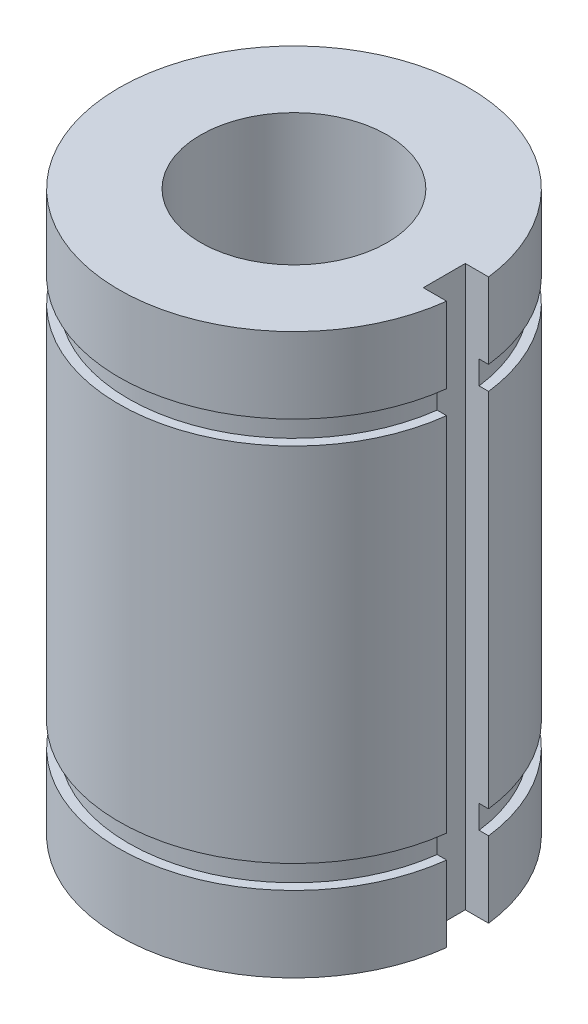
ISO-10303-21;
HEADER;
FILE_DESCRIPTION(('STEP AP214'),'2;1');
FILE_NAME('part.step','',(''),(''),'','','');
FILE_SCHEMA(('AUTOMOTIVE_DESIGN { 1 0 10303 214 1 1 1 1 }'));
ENDSEC;
DATA;
#1=APPLICATION_CONTEXT('core data for automotive mechanical design processes');
#2=APPLICATION_PROTOCOL_DEFINITION('international standard','automotive_design',2000,#1);
#3=PRODUCT_CONTEXT('',#1,'mechanical');
#4=PRODUCT('Part','Part','',(#3));
#5=PRODUCT_RELATED_PRODUCT_CATEGORY('part','',(#4));
#6=PRODUCT_DEFINITION_FORMATION('','',#4);
#7=PRODUCT_DEFINITION_CONTEXT('part definition',#1,'design');
#8=PRODUCT_DEFINITION('design','',#6,#7);
#9=PRODUCT_DEFINITION_SHAPE('','',#8);
#10=(LENGTH_UNIT() NAMED_UNIT(*) SI_UNIT(.MILLI.,.METRE.));
#11=(NAMED_UNIT(*) PLANE_ANGLE_UNIT() SI_UNIT($,.RADIAN.));
#12=(NAMED_UNIT(*) SI_UNIT($,.STERADIAN.) SOLID_ANGLE_UNIT());
#13=UNCERTAINTY_MEASURE_WITH_UNIT(LENGTH_MEASURE(1.E-05),#10,'distance_accuracy_value','');
#14=(GEOMETRIC_REPRESENTATION_CONTEXT(3) GLOBAL_UNCERTAINTY_ASSIGNED_CONTEXT((#13)) GLOBAL_UNIT_ASSIGNED_CONTEXT((#10,
#11,#12)) REPRESENTATION_CONTEXT('',''));
#15=CARTESIAN_POINT('',(0.,0.,0.));
#16=DIRECTION('',(0.,0.,1.));
#17=DIRECTION('',(1.,0.,0.));
#18=AXIS2_PLACEMENT_3D('',#15,#16,#17);
#19=CARTESIAN_POINT('',(0.,24.,0.));
#20=DIRECTION('',(0.,-1.,0.));
#21=DIRECTION('',(0.,0.,-1.));
#22=AXIS2_PLACEMENT_3D('',#19,#20,#21);
#23=CYLINDRICAL_SURFACE('',#22,7.5);
#24=DIRECTION('',(0.,-1.,0.));
#25=VECTOR('',#24,1.);
#26=CARTESIAN_POINT('',(7.44580418759451,24.,-0.899999999999999));
#27=LINE('',#26,#25);
#28=CARTESIAN_POINT('',(7.44580418759451,19.75,-0.899999999999999));
#29=VERTEX_POINT('',#28);
#30=CARTESIAN_POINT('',(7.44580418759451,4.25,-0.899999999999999));
#31=VERTEX_POINT('',#30);
#32=EDGE_CURVE('E212',#29,#31,#27,.T.);
#33=ORIENTED_EDGE('',*,*,#32,.T.);
#34=CARTESIAN_POINT('',(0.,4.25,0.));
#35=DIRECTION('',(0.,1.,0.));
#36=DIRECTION('',(0.,0.,1.));
#37=AXIS2_PLACEMENT_3D('',#34,#35,#36);
#38=CIRCLE('',#37,7.5);
#39=CARTESIAN_POINT('',(7.44580418759451,4.25,0.900000000000001));
#40=VERTEX_POINT('',#39);
#41=EDGE_CURVE('E133',#31,#40,#38,.T.);
#42=ORIENTED_EDGE('',*,*,#41,.T.);
#43=DIRECTION('',(0.,-1.,0.));
#44=VECTOR('',#43,1.);
#45=CARTESIAN_POINT('',(7.44580418759451,24.,0.900000000000001));
#46=LINE('',#45,#44);
#47=CARTESIAN_POINT('',(7.44580418759451,19.75,0.900000000000001));
#48=VERTEX_POINT('',#47);
#49=EDGE_CURVE('E207',#40,#48,#46,.F.);
#50=ORIENTED_EDGE('',*,*,#49,.T.);
#51=CARTESIAN_POINT('',(0.,19.75,0.));
#52=DIRECTION('',(0.,-1.,0.));
#53=DIRECTION('',(0.,0.,-1.));
#54=AXIS2_PLACEMENT_3D('',#51,#52,#53);
#55=CIRCLE('',#54,7.5);
#56=EDGE_CURVE('E164',#48,#29,#55,.T.);
#57=ORIENTED_EDGE('',*,*,#56,.T.);
#58=EDGE_LOOP('',(#33,#42,#50,#57));
#59=FACE_BOUND('',#58,.T.);
#60=ADVANCED_FACE('F33',(#59),#23,.T.);
#61=CARTESIAN_POINT('',(7.44580418759451,0.,0.900000000000001));
#62=VERTEX_POINT('',#61);
#63=CARTESIAN_POINT('',(7.44580418759451,3.25,0.900000000000001));
#64=VERTEX_POINT('',#63);
#65=EDGE_CURVE('E204',#62,#64,#46,.F.);
#66=ORIENTED_EDGE('',*,*,#65,.T.);
#67=CARTESIAN_POINT('',(0.,3.25,0.));
#68=DIRECTION('',(0.,-1.,0.));
#69=DIRECTION('',(0.,0.,-1.));
#70=AXIS2_PLACEMENT_3D('',#67,#68,#69);
#71=CIRCLE('',#70,7.5);
#72=CARTESIAN_POINT('',(7.44580418759451,3.25,-0.899999999999999));
#73=VERTEX_POINT('',#72);
#74=EDGE_CURVE('E48',#64,#73,#71,.T.);
#75=ORIENTED_EDGE('',*,*,#74,.T.);
#76=CARTESIAN_POINT('',(7.44580418759451,0.,-0.899999999999999));
#77=VERTEX_POINT('',#76);
#78=EDGE_CURVE('E142',#73,#77,#27,.T.);
#79=ORIENTED_EDGE('',*,*,#78,.T.);
#80=CARTESIAN_POINT('',(0.,0.,0.));
#81=DIRECTION('',(0.,1.,0.));
#82=DIRECTION('',(0.,0.,1.));
#83=AXIS2_PLACEMENT_3D('',#80,#81,#82);
#84=CIRCLE('',#83,7.5);
#85=EDGE_CURVE('E195',#77,#62,#84,.T.);
#86=ORIENTED_EDGE('',*,*,#85,.T.);
#87=EDGE_LOOP('',(#66,#75,#79,#86));
#88=FACE_BOUND('',#87,.T.);
#89=ADVANCED_FACE('F231',(#88),#23,.T.);
#90=CARTESIAN_POINT('',(0.,24.,0.));
#91=DIRECTION('',(0.,1.,0.));
#92=DIRECTION('',(0.,0.,1.));
#93=AXIS2_PLACEMENT_3D('',#90,#91,#92);
#94=PLANE('',#93);
#95=DIRECTION('',(1.,0.,0.));
#96=VECTOR('',#95,1.);
#97=CARTESIAN_POINT('',(8.44580418759451,24.,-0.899999999999999));
#98=LINE('',#97,#96);
#99=CARTESIAN_POINT('',(6.44580418759451,24.,-0.899999999999999));
#100=VERTEX_POINT('',#99);
#101=CARTESIAN_POINT('',(7.44580418759451,24.,-0.899999999999999));
#102=VERTEX_POINT('',#101);
#103=EDGE_CURVE('E178',#100,#102,#98,.T.);
#104=ORIENTED_EDGE('',*,*,#103,.T.);
#105=CARTESIAN_POINT('',(0.,24.,0.));
#106=DIRECTION('',(0.,1.,0.));
#107=DIRECTION('',(0.,0.,1.));
#108=AXIS2_PLACEMENT_3D('',#105,#106,#107);
#109=CIRCLE('',#108,7.5);
#110=CARTESIAN_POINT('',(7.44580418759451,24.,0.900000000000001));
#111=VERTEX_POINT('',#110);
#112=EDGE_CURVE('E198',#102,#111,#109,.T.);
#113=ORIENTED_EDGE('',*,*,#112,.T.);
#114=DIRECTION('',(-1.,0.,0.));
#115=VECTOR('',#114,1.);
#116=CARTESIAN_POINT('',(8.44580418759451,24.,0.900000000000001));
#117=LINE('',#116,#115);
#118=CARTESIAN_POINT('',(6.44580418759451,24.,0.900000000000001));
#119=VERTEX_POINT('',#118);
#120=EDGE_CURVE('E171',#111,#119,#117,.T.);
#121=ORIENTED_EDGE('',*,*,#120,.T.);
#122=DIRECTION('',(0.,0.,-1.));
#123=VECTOR('',#122,1.);
#124=CARTESIAN_POINT('',(6.44580418759451,24.,-0.899999999999999));
#125=LINE('',#124,#123);
#126=EDGE_CURVE('E174',#119,#100,#125,.T.);
#127=ORIENTED_EDGE('',*,*,#126,.T.);
#128=EDGE_LOOP('',(#104,#113,#121,#127));
#129=FACE_BOUND('',#128,.T.);
#130=CARTESIAN_POINT('',(0.,24.,0.));
#131=DIRECTION('',(0.,1.,0.));
#132=DIRECTION('',(0.,0.,1.));
#133=AXIS2_PLACEMENT_3D('',#130,#131,#132);
#134=CIRCLE('',#133,4.);
#135=CARTESIAN_POINT('',(0.,24.,4.));
#136=VERTEX_POINT('',#135);
#137=EDGE_CURVE('E192',#136,#136,#134,.T.);
#138=ORIENTED_EDGE('',*,*,#137,.F.);
#139=EDGE_LOOP('',(#138));
#140=FACE_BOUND('',#139,.T.);
#141=ADVANCED_FACE('F245',(#129,#140),#94,.T.);
#142=CARTESIAN_POINT('',(0.,0.,0.));
#143=DIRECTION('',(0.,1.,0.));
#144=DIRECTION('',(0.,0.,1.));
#145=AXIS2_PLACEMENT_3D('',#142,#143,#144);
#146=PLANE('',#145);
#147=ORIENTED_EDGE('',*,*,#85,.F.);
#148=DIRECTION('',(1.,0.,0.));
#149=VECTOR('',#148,1.);
#150=CARTESIAN_POINT('',(8.44580418759451,0.,-0.899999999999999));
#151=LINE('',#150,#149);
#152=CARTESIAN_POINT('',(6.44580418759451,0.,-0.899999999999999));
#153=VERTEX_POINT('',#152);
#154=EDGE_CURVE('E175',#153,#77,#151,.T.);
#155=ORIENTED_EDGE('',*,*,#154,.F.);
#156=DIRECTION('',(0.,0.,-1.));
#157=VECTOR('',#156,1.);
#158=CARTESIAN_POINT('',(6.44580418759451,0.,-0.899999999999999));
#159=LINE('',#158,#157);
#160=CARTESIAN_POINT('',(6.44580418759451,0.,0.900000000000001));
#161=VERTEX_POINT('',#160);
#162=EDGE_CURVE('E183',#161,#153,#159,.T.);
#163=ORIENTED_EDGE('',*,*,#162,.F.);
#164=DIRECTION('',(-1.,0.,0.));
#165=VECTOR('',#164,1.);
#166=CARTESIAN_POINT('',(8.44580418759451,0.,0.900000000000001));
#167=LINE('',#166,#165);
#168=EDGE_CURVE('E170',#62,#161,#167,.T.);
#169=ORIENTED_EDGE('',*,*,#168,.F.);
#170=EDGE_LOOP('',(#147,#155,#163,#169));
#171=FACE_BOUND('',#170,.T.);
#172=CARTESIAN_POINT('',(0.,0.,0.));
#173=DIRECTION('',(0.,1.,0.));
#174=DIRECTION('',(0.,0.,1.));
#175=AXIS2_PLACEMENT_3D('',#172,#173,#174);
#176=CIRCLE('',#175,4.);
#177=CARTESIAN_POINT('',(0.,0.,4.));
#178=VERTEX_POINT('',#177);
#179=EDGE_CURVE('E189',#178,#178,#176,.T.);
#180=ORIENTED_EDGE('',*,*,#179,.T.);
#181=EDGE_LOOP('',(#180));
#182=FACE_BOUND('',#181,.T.);
#183=ADVANCED_FACE('F238',(#171,#182),#146,.F.);
#184=CARTESIAN_POINT('',(7.44580418759451,20.75,-0.899999999999999));
#185=VERTEX_POINT('',#184);
#186=EDGE_CURVE('E208',#102,#185,#27,.T.);
#187=ORIENTED_EDGE('',*,*,#186,.T.);
#188=CARTESIAN_POINT('',(0.,20.75,0.));
#189=DIRECTION('',(0.,1.,0.));
#190=DIRECTION('',(0.,0.,1.));
#191=AXIS2_PLACEMENT_3D('',#188,#189,#190);
#192=CIRCLE('',#191,7.5);
#193=CARTESIAN_POINT('',(7.44580418759451,20.75,0.900000000000001));
#194=VERTEX_POINT('',#193);
#195=EDGE_CURVE('E155',#185,#194,#192,.T.);
#196=ORIENTED_EDGE('',*,*,#195,.T.);
#197=EDGE_CURVE('E201',#194,#111,#46,.F.);
#198=ORIENTED_EDGE('',*,*,#197,.T.);
#199=ORIENTED_EDGE('',*,*,#112,.F.);
#200=EDGE_LOOP('',(#187,#196,#198,#199));
#201=FACE_BOUND('',#200,.T.);
#202=ADVANCED_FACE('F35',(#201),#23,.T.);
#203=CARTESIAN_POINT('',(0.,24.,0.));
#204=DIRECTION('',(0.,-1.,0.));
#205=DIRECTION('',(0.,0.,-1.));
#206=AXIS2_PLACEMENT_3D('',#203,#204,#205);
#207=CYLINDRICAL_SURFACE('',#206,4.);
#208=ORIENTED_EDGE('',*,*,#137,.T.);
#209=EDGE_LOOP('',(#208));
#210=FACE_BOUND('',#209,.T.);
#211=ORIENTED_EDGE('',*,*,#179,.F.);
#212=EDGE_LOOP('',(#211));
#213=FACE_BOUND('',#212,.T.);
#214=ADVANCED_FACE('F269',(#210,#213),#207,.F.);
#215=CARTESIAN_POINT('',(8.44580418759451,24.,-0.899999999999999));
#216=DIRECTION('',(0.,0.,-1.));
#217=DIRECTION('',(-1.,0.,0.));
#218=AXIS2_PLACEMENT_3D('',#215,#216,#217);
#219=PLANE('',#218);
#220=DIRECTION('',(0.,-1.,0.));
#221=VECTOR('',#220,1.);
#222=CARTESIAN_POINT('',(7.03849679041511,24.,-0.899999999999999));
#223=LINE('',#222,#221);
#224=CARTESIAN_POINT('',(7.03849679041511,3.25,-0.899999999999999));
#225=VERTEX_POINT('',#224);
#226=CARTESIAN_POINT('',(7.03849679041511,4.25,-0.899999999999999));
#227=VERTEX_POINT('',#226);
#228=EDGE_CURVE('E123',#225,#227,#223,.F.);
#229=ORIENTED_EDGE('',*,*,#228,.T.);
#230=DIRECTION('',(1.,0.,0.));
#231=VECTOR('',#230,1.);
#232=CARTESIAN_POINT('',(8.44580418759451,4.25,-0.899999999999999));
#233=LINE('',#232,#231);
#234=EDGE_CURVE('E149',#227,#31,#233,.T.);
#235=ORIENTED_EDGE('',*,*,#234,.T.);
#236=ORIENTED_EDGE('',*,*,#32,.F.);
#237=DIRECTION('',(-1.,0.,0.));
#238=VECTOR('',#237,1.);
#239=CARTESIAN_POINT('',(8.44580418759451,19.75,-0.899999999999999));
#240=LINE('',#239,#238);
#241=CARTESIAN_POINT('',(7.03849679041511,19.75,-0.899999999999999));
#242=VERTEX_POINT('',#241);
#243=EDGE_CURVE('E167',#29,#242,#240,.T.);
#244=ORIENTED_EDGE('',*,*,#243,.T.);
#245=DIRECTION('',(0.,-1.,0.));
#246=VECTOR('',#245,1.);
#247=CARTESIAN_POINT('',(7.03849679041511,24.,-0.899999999999999));
#248=LINE('',#247,#246);
#249=CARTESIAN_POINT('',(7.03849679041511,20.75,-0.899999999999999));
#250=VERTEX_POINT('',#249);
#251=EDGE_CURVE('E161',#242,#250,#248,.F.);
#252=ORIENTED_EDGE('',*,*,#251,.T.);
#253=DIRECTION('',(1.,0.,0.));
#254=VECTOR('',#253,1.);
#255=CARTESIAN_POINT('',(8.44580418759451,20.75,-0.899999999999999));
#256=LINE('',#255,#254);
#257=EDGE_CURVE('E158',#250,#185,#256,.T.);
#258=ORIENTED_EDGE('',*,*,#257,.T.);
#259=ORIENTED_EDGE('',*,*,#186,.F.);
#260=ORIENTED_EDGE('',*,*,#103,.F.);
#261=DIRECTION('',(0.,-1.,0.));
#262=VECTOR('',#261,1.);
#263=CARTESIAN_POINT('',(6.44580418759451,24.,-0.899999999999999));
#264=LINE('',#263,#262);
#265=EDGE_CURVE('E187',#100,#153,#264,.T.);
#266=ORIENTED_EDGE('',*,*,#265,.T.);
#267=ORIENTED_EDGE('',*,*,#154,.T.);
#268=ORIENTED_EDGE('',*,*,#78,.F.);
#269=DIRECTION('',(-1.,0.,0.));
#270=VECTOR('',#269,1.);
#271=CARTESIAN_POINT('',(8.44580418759451,3.25,-0.899999999999999));
#272=LINE('',#271,#270);
#273=EDGE_CURVE('E134',#73,#225,#272,.T.);
#274=ORIENTED_EDGE('',*,*,#273,.T.);
#275=EDGE_LOOP('',(#229,#235,#236,#244,#252,#258,#259,#260,#266,#267,#268,#274));
#276=FACE_BOUND('',#275,.T.);
#277=ADVANCED_FACE('F140',(#276),#219,.F.);
#278=CARTESIAN_POINT('',(8.44580418759451,24.,0.900000000000001));
#279=DIRECTION('',(0.,0.,1.));
#280=DIRECTION('',(1.,0.,0.));
#281=AXIS2_PLACEMENT_3D('',#278,#279,#280);
#282=PLANE('',#281);
#283=ORIENTED_EDGE('',*,*,#49,.F.);
#284=DIRECTION('',(-1.,0.,0.));
#285=VECTOR('',#284,1.);
#286=CARTESIAN_POINT('',(8.44580418759451,4.25,0.900000000000001));
#287=LINE('',#286,#285);
#288=CARTESIAN_POINT('',(7.03849679041511,4.25,0.900000000000001));
#289=VERTEX_POINT('',#288);
#290=EDGE_CURVE('E11',#40,#289,#287,.T.);
#291=ORIENTED_EDGE('',*,*,#290,.T.);
#292=DIRECTION('',(0.,-1.,0.));
#293=VECTOR('',#292,1.);
#294=CARTESIAN_POINT('',(7.03849679041511,24.,0.900000000000001));
#295=LINE('',#294,#293);
#296=CARTESIAN_POINT('',(7.03849679041511,3.25,0.900000000000001));
#297=VERTEX_POINT('',#296);
#298=EDGE_CURVE('E41',#289,#297,#295,.T.);
#299=ORIENTED_EDGE('',*,*,#298,.T.);
#300=DIRECTION('',(1.,0.,0.));
#301=VECTOR('',#300,1.);
#302=CARTESIAN_POINT('',(8.44580418759451,3.25,0.900000000000001));
#303=LINE('',#302,#301);
#304=EDGE_CURVE('E137',#297,#64,#303,.T.);
#305=ORIENTED_EDGE('',*,*,#304,.T.);
#306=ORIENTED_EDGE('',*,*,#65,.F.);
#307=ORIENTED_EDGE('',*,*,#168,.T.);
#308=DIRECTION('',(0.,-1.,0.));
#309=VECTOR('',#308,1.);
#310=CARTESIAN_POINT('',(6.44580418759451,24.,0.900000000000001));
#311=LINE('',#310,#309);
#312=EDGE_CURVE('E181',#119,#161,#311,.T.);
#313=ORIENTED_EDGE('',*,*,#312,.F.);
#314=ORIENTED_EDGE('',*,*,#120,.F.);
#315=ORIENTED_EDGE('',*,*,#197,.F.);
#316=DIRECTION('',(-1.,0.,0.));
#317=VECTOR('',#316,1.);
#318=CARTESIAN_POINT('',(8.44580418759451,20.75,0.900000000000001));
#319=LINE('',#318,#317);
#320=CARTESIAN_POINT('',(7.03849679041511,20.75,0.900000000000001));
#321=VERTEX_POINT('',#320);
#322=EDGE_CURVE('E211',#194,#321,#319,.T.);
#323=ORIENTED_EDGE('',*,*,#322,.T.);
#324=DIRECTION('',(0.,-1.,0.));
#325=VECTOR('',#324,1.);
#326=CARTESIAN_POINT('',(7.03849679041511,24.,0.900000000000001));
#327=LINE('',#326,#325);
#328=CARTESIAN_POINT('',(7.03849679041511,19.75,0.900000000000001));
#329=VERTEX_POINT('',#328);
#330=EDGE_CURVE('E215',#321,#329,#327,.T.);
#331=ORIENTED_EDGE('',*,*,#330,.T.);
#332=DIRECTION('',(1.,0.,0.));
#333=VECTOR('',#332,1.);
#334=CARTESIAN_POINT('',(8.44580418759451,19.75,0.900000000000001));
#335=LINE('',#334,#333);
#336=EDGE_CURVE('E218',#329,#48,#335,.T.);
#337=ORIENTED_EDGE('',*,*,#336,.T.);
#338=EDGE_LOOP('',(#283,#291,#299,#305,#306,#307,#313,#314,#315,#323,#331,#337));
#339=FACE_BOUND('',#338,.T.);
#340=ADVANCED_FACE('F223',(#339),#282,.F.);
#341=CARTESIAN_POINT('',(6.44580418759451,24.,-0.899999999999999));
#342=DIRECTION('',(-1.,0.,0.));
#343=DIRECTION('',(0.,0.,1.));
#344=AXIS2_PLACEMENT_3D('',#341,#342,#343);
#345=PLANE('',#344);
#346=ORIENTED_EDGE('',*,*,#162,.T.);
#347=ORIENTED_EDGE('',*,*,#265,.F.);
#348=ORIENTED_EDGE('',*,*,#126,.F.);
#349=ORIENTED_EDGE('',*,*,#312,.T.);
#350=EDGE_LOOP('',(#346,#347,#348,#349));
#351=FACE_BOUND('',#350,.T.);
#352=ADVANCED_FACE('F243',(#351),#345,.F.);
#353=CARTESIAN_POINT('',(8.09580418759451,19.75,0.));
#354=DIRECTION('',(0.,-1.,0.));
#355=DIRECTION('',(0.,0.,-1.));
#356=AXIS2_PLACEMENT_3D('',#353,#354,#355);
#357=PLANE('',#356);
#358=ORIENTED_EDGE('',*,*,#56,.F.);
#359=ORIENTED_EDGE('',*,*,#336,.F.);
#360=CARTESIAN_POINT('',(0.,19.75,0.));
#361=DIRECTION('',(0.,-1.,0.));
#362=DIRECTION('',(0.,0.,-1.));
#363=AXIS2_PLACEMENT_3D('',#360,#361,#362);
#364=CIRCLE('',#363,7.09580418759451);
#365=EDGE_CURVE('E152',#329,#242,#364,.T.);
#366=ORIENTED_EDGE('',*,*,#365,.T.);
#367=ORIENTED_EDGE('',*,*,#243,.F.);
#368=EDGE_LOOP('',(#358,#359,#366,#367));
#369=FACE_BOUND('',#368,.T.);
#370=ADVANCED_FACE('F251',(#369),#357,.F.);
#371=CARTESIAN_POINT('',(0.,24.,0.));
#372=DIRECTION('',(0.,-1.,0.));
#373=DIRECTION('',(0.,0.,-1.));
#374=AXIS2_PLACEMENT_3D('',#371,#372,#373);
#375=CYLINDRICAL_SURFACE('',#374,7.09580418759451);
#376=ORIENTED_EDGE('',*,*,#365,.F.);
#377=ORIENTED_EDGE('',*,*,#330,.F.);
#378=CARTESIAN_POINT('',(0.,20.75,0.));
#379=DIRECTION('',(0.,-1.,0.));
#380=DIRECTION('',(0.,0.,-1.));
#381=AXIS2_PLACEMENT_3D('',#378,#379,#380);
#382=CIRCLE('',#381,7.09580418759451);
#383=EDGE_CURVE('E56',#321,#250,#382,.T.);
#384=ORIENTED_EDGE('',*,*,#383,.T.);
#385=ORIENTED_EDGE('',*,*,#251,.F.);
#386=EDGE_LOOP('',(#376,#377,#384,#385));
#387=FACE_BOUND('',#386,.T.);
#388=ADVANCED_FACE('F254',(#387),#375,.T.);
#389=CARTESIAN_POINT('',(8.09580418759451,20.75,0.));
#390=DIRECTION('',(0.,1.,0.));
#391=DIRECTION('',(0.,0.,1.));
#392=AXIS2_PLACEMENT_3D('',#389,#390,#391);
#393=PLANE('',#392);
#394=ORIENTED_EDGE('',*,*,#383,.F.);
#395=ORIENTED_EDGE('',*,*,#322,.F.);
#396=ORIENTED_EDGE('',*,*,#195,.F.);
#397=ORIENTED_EDGE('',*,*,#257,.F.);
#398=EDGE_LOOP('',(#394,#395,#396,#397));
#399=FACE_BOUND('',#398,.T.);
#400=ADVANCED_FACE('F255',(#399),#393,.F.);
#401=CARTESIAN_POINT('',(8.09580418759451,4.25,0.));
#402=DIRECTION('',(0.,1.,0.));
#403=DIRECTION('',(0.,0.,1.));
#404=AXIS2_PLACEMENT_3D('',#401,#402,#403);
#405=PLANE('',#404);
#406=CARTESIAN_POINT('',(0.,4.25,0.));
#407=DIRECTION('',(0.,-1.,0.));
#408=DIRECTION('',(0.,0.,-1.));
#409=AXIS2_PLACEMENT_3D('',#406,#407,#408);
#410=CIRCLE('',#409,7.09580418759451);
#411=EDGE_CURVE('E129',#289,#227,#410,.T.);
#412=ORIENTED_EDGE('',*,*,#411,.F.);
#413=ORIENTED_EDGE('',*,*,#290,.F.);
#414=ORIENTED_EDGE('',*,*,#41,.F.);
#415=ORIENTED_EDGE('',*,*,#234,.F.);
#416=EDGE_LOOP('',(#412,#413,#414,#415));
#417=FACE_BOUND('',#416,.T.);
#418=ADVANCED_FACE('F225',(#417),#405,.F.);
#419=CARTESIAN_POINT('',(0.,24.,0.));
#420=DIRECTION('',(0.,-1.,0.));
#421=DIRECTION('',(0.,0.,-1.));
#422=AXIS2_PLACEMENT_3D('',#419,#420,#421);
#423=CYLINDRICAL_SURFACE('',#422,7.09580418759451);
#424=CARTESIAN_POINT('',(0.,3.25,0.));
#425=DIRECTION('',(0.,-1.,0.));
#426=DIRECTION('',(0.,0.,-1.));
#427=AXIS2_PLACEMENT_3D('',#424,#425,#426);
#428=CIRCLE('',#427,7.09580418759451);
#429=EDGE_CURVE('E126',#297,#225,#428,.T.);
#430=ORIENTED_EDGE('',*,*,#429,.F.);
#431=ORIENTED_EDGE('',*,*,#298,.F.);
#432=ORIENTED_EDGE('',*,*,#411,.T.);
#433=ORIENTED_EDGE('',*,*,#228,.F.);
#434=EDGE_LOOP('',(#430,#431,#432,#433));
#435=FACE_BOUND('',#434,.T.);
#436=ADVANCED_FACE('F125',(#435),#423,.T.);
#437=CARTESIAN_POINT('',(8.09580418759451,3.25,0.));
#438=DIRECTION('',(0.,-1.,0.));
#439=DIRECTION('',(0.,0.,-1.));
#440=AXIS2_PLACEMENT_3D('',#437,#438,#439);
#441=PLANE('',#440);
#442=ORIENTED_EDGE('',*,*,#74,.F.);
#443=ORIENTED_EDGE('',*,*,#304,.F.);
#444=ORIENTED_EDGE('',*,*,#429,.T.);
#445=ORIENTED_EDGE('',*,*,#273,.F.);
#446=EDGE_LOOP('',(#442,#443,#444,#445));
#447=FACE_BOUND('',#446,.T.);
#448=ADVANCED_FACE('F136',(#447),#441,.F.);
#449=CLOSED_SHELL('',(#60,#89,#141,#183,#202,#214,#277,#340,#352,#370,#388,#400,#418,#436,#448));
#450=MANIFOLD_SOLID_BREP('B2',#449);
#451=ADVANCED_BREP_SHAPE_REPRESENTATION('',(#18,#450),#14);
#452=SHAPE_DEFINITION_REPRESENTATION(#9,#451);
ENDSEC;
END-ISO-10303-21;
